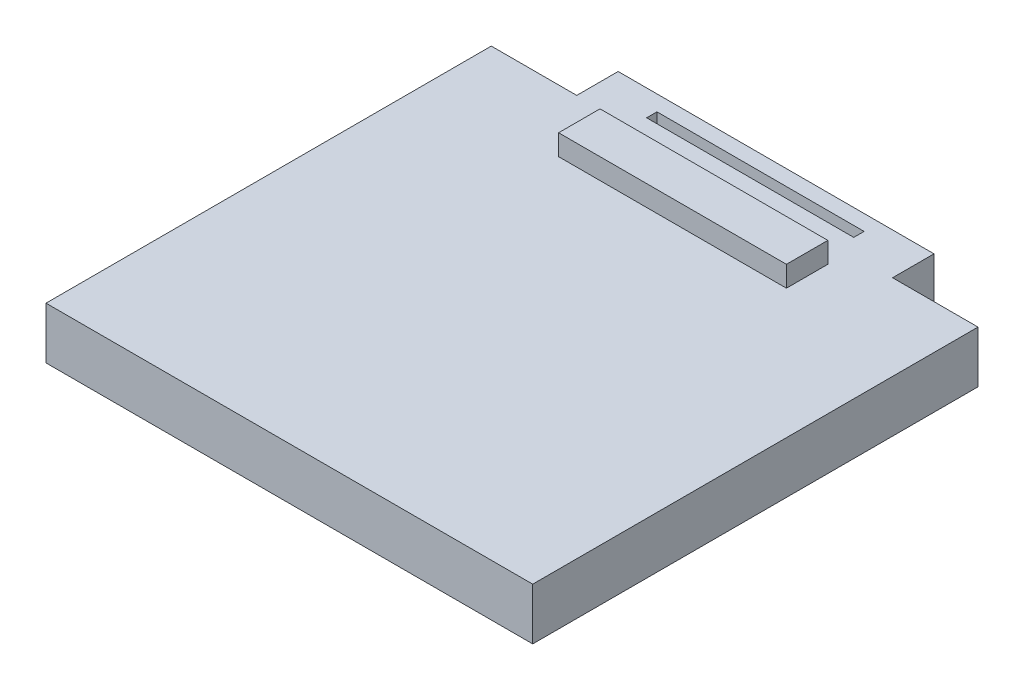
ISO-10303-21;
HEADER;
FILE_DESCRIPTION(('STEP AP214'),'2;1');
FILE_NAME('part.step','',(''),(''),'','','');
FILE_SCHEMA(('AUTOMOTIVE_DESIGN { 1 0 10303 214 1 1 1 1 }'));
ENDSEC;
DATA;
#1=APPLICATION_CONTEXT('core data for automotive mechanical design processes');
#2=APPLICATION_PROTOCOL_DEFINITION('international standard','automotive_design',2000,#1);
#3=PRODUCT_CONTEXT('',#1,'mechanical');
#4=PRODUCT('Part','Part','',(#3));
#5=PRODUCT_RELATED_PRODUCT_CATEGORY('part','',(#4));
#6=PRODUCT_DEFINITION_FORMATION('','',#4);
#7=PRODUCT_DEFINITION_CONTEXT('part definition',#1,'design');
#8=PRODUCT_DEFINITION('design','',#6,#7);
#9=PRODUCT_DEFINITION_SHAPE('','',#8);
#10=(LENGTH_UNIT() NAMED_UNIT(*) SI_UNIT(.MILLI.,.METRE.));
#11=(NAMED_UNIT(*) PLANE_ANGLE_UNIT() SI_UNIT($,.RADIAN.));
#12=(NAMED_UNIT(*) SI_UNIT($,.STERADIAN.) SOLID_ANGLE_UNIT());
#13=UNCERTAINTY_MEASURE_WITH_UNIT(LENGTH_MEASURE(1.E-05),#10,'distance_accuracy_value','');
#14=(GEOMETRIC_REPRESENTATION_CONTEXT(3) GLOBAL_UNCERTAINTY_ASSIGNED_CONTEXT((#13)) GLOBAL_UNIT_ASSIGNED_CONTEXT((#10,
#11,#12)) REPRESENTATION_CONTEXT('',''));
#15=CARTESIAN_POINT('',(0.,0.,0.));
#16=DIRECTION('',(0.,0.,1.));
#17=DIRECTION('',(1.,0.,0.));
#18=AXIS2_PLACEMENT_3D('',#15,#16,#17);
#19=CARTESIAN_POINT('',(0.,2.5,0.));
#20=DIRECTION('',(0.,1.,0.));
#21=DIRECTION('',(0.,0.,1.));
#22=AXIS2_PLACEMENT_3D('',#19,#20,#21);
#23=PLANE('',#22);
#24=DIRECTION('',(0.,0.,-1.));
#25=VECTOR('',#24,1.);
#26=CARTESIAN_POINT('',(5.00000000000001,2.5,-12.));
#27=LINE('',#26,#25);
#28=CARTESIAN_POINT('',(5.00000000000001,2.5,-11.5));
#29=VERTEX_POINT('',#28);
#30=CARTESIAN_POINT('',(5.00000000000001,2.5,-12.));
#31=VERTEX_POINT('',#30);
#32=EDGE_CURVE('E56',#29,#31,#27,.T.);
#33=ORIENTED_EDGE('',*,*,#32,.F.);
#34=DIRECTION('',(1.,0.,0.));
#35=VECTOR('',#34,1.);
#36=CARTESIAN_POINT('',(-4.99999999999999,2.5,-11.5));
#37=LINE('',#36,#35);
#38=CARTESIAN_POINT('',(-4.99999999999999,2.5,-11.5));
#39=VERTEX_POINT('',#38);
#40=EDGE_CURVE('E175',#39,#29,#37,.T.);
#41=ORIENTED_EDGE('',*,*,#40,.F.);
#42=DIRECTION('',(0.,0.,1.));
#43=VECTOR('',#42,1.);
#44=CARTESIAN_POINT('',(-4.99999999999999,2.5,-12.));
#45=LINE('',#44,#43);
#46=CARTESIAN_POINT('',(-4.99999999999999,2.5,-12.));
#47=VERTEX_POINT('',#46);
#48=EDGE_CURVE('E178',#47,#39,#45,.T.);
#49=ORIENTED_EDGE('',*,*,#48,.F.);
#50=DIRECTION('',(-1.,0.,0.));
#51=VECTOR('',#50,1.);
#52=CARTESIAN_POINT('',(-4.99999999999999,2.5,-12.));
#53=LINE('',#52,#51);
#54=EDGE_CURVE('E184',#31,#47,#53,.T.);
#55=ORIENTED_EDGE('',*,*,#54,.F.);
#56=EDGE_LOOP('',(#33,#41,#49,#55));
#57=FACE_BOUND('',#56,.T.);
#58=DIRECTION('',(0.,0.,-1.));
#59=VECTOR('',#58,1.);
#60=CARTESIAN_POINT('',(11.75,2.5,-10.75));
#61=LINE('',#60,#59);
#62=CARTESIAN_POINT('',(11.75,2.5,10.75));
#63=VERTEX_POINT('',#62);
#64=CARTESIAN_POINT('',(11.75,2.5,-10.75));
#65=VERTEX_POINT('',#64);
#66=EDGE_CURVE('E248',#63,#65,#61,.T.);
#67=ORIENTED_EDGE('',*,*,#66,.T.);
#68=DIRECTION('',(-1.,0.,0.));
#69=VECTOR('',#68,1.);
#70=CARTESIAN_POINT('',(-11.75,2.5,-10.75));
#71=LINE('',#70,#69);
#72=CARTESIAN_POINT('',(7.625,2.5,-10.75));
#73=VERTEX_POINT('',#72);
#74=EDGE_CURVE('E253',#65,#73,#71,.T.);
#75=ORIENTED_EDGE('',*,*,#74,.T.);
#76=DIRECTION('',(0.,0.,1.));
#77=VECTOR('',#76,1.);
#78=CARTESIAN_POINT('',(7.625,2.5,-12.75));
#79=LINE('',#78,#77);
#80=CARTESIAN_POINT('',(7.625,2.5,-12.75));
#81=VERTEX_POINT('',#80);
#82=EDGE_CURVE('E244',#81,#73,#79,.T.);
#83=ORIENTED_EDGE('',*,*,#82,.F.);
#84=DIRECTION('',(1.,0.,0.));
#85=VECTOR('',#84,1.);
#86=CARTESIAN_POINT('',(-7.625,2.5,-12.75));
#87=LINE('',#86,#85);
#88=CARTESIAN_POINT('',(-7.625,2.5,-12.75));
#89=VERTEX_POINT('',#88);
#90=EDGE_CURVE('E221',#89,#81,#87,.T.);
#91=ORIENTED_EDGE('',*,*,#90,.F.);
#92=DIRECTION('',(0.,0.,1.));
#93=VECTOR('',#92,1.);
#94=CARTESIAN_POINT('',(-7.625,2.5,-12.75));
#95=LINE('',#94,#93);
#96=CARTESIAN_POINT('',(-7.625,2.5,-10.75));
#97=VERTEX_POINT('',#96);
#98=EDGE_CURVE('E231',#89,#97,#95,.T.);
#99=ORIENTED_EDGE('',*,*,#98,.T.);
#100=CARTESIAN_POINT('',(-11.75,2.5,-10.75));
#101=VERTEX_POINT('',#100);
#102=EDGE_CURVE('E251',#97,#101,#71,.T.);
#103=ORIENTED_EDGE('',*,*,#102,.T.);
#104=DIRECTION('',(0.,0.,1.));
#105=VECTOR('',#104,1.);
#106=CARTESIAN_POINT('',(-11.75,2.5,-10.75));
#107=LINE('',#106,#105);
#108=CARTESIAN_POINT('',(-11.75,2.5,10.75));
#109=VERTEX_POINT('',#108);
#110=EDGE_CURVE('E256',#101,#109,#107,.T.);
#111=ORIENTED_EDGE('',*,*,#110,.T.);
#112=DIRECTION('',(1.,0.,0.));
#113=VECTOR('',#112,1.);
#114=CARTESIAN_POINT('',(-11.75,2.5,10.75));
#115=LINE('',#114,#113);
#116=EDGE_CURVE('E258',#109,#63,#115,.T.);
#117=ORIENTED_EDGE('',*,*,#116,.T.);
#118=EDGE_LOOP('',(#67,#75,#83,#91,#99,#103,#111,#117));
#119=FACE_BOUND('',#118,.T.);
#120=DIRECTION('',(-1.,0.,0.));
#121=VECTOR('',#120,1.);
#122=CARTESIAN_POINT('',(-5.50000000000001,2.5,-9.75));
#123=LINE('',#122,#121);
#124=CARTESIAN_POINT('',(5.49999999999999,2.5,-9.75));
#125=VERTEX_POINT('',#124);
#126=CARTESIAN_POINT('',(-5.50000000000001,2.5,-9.75));
#127=VERTEX_POINT('',#126);
#128=EDGE_CURVE('E207',#125,#127,#123,.T.);
#129=ORIENTED_EDGE('',*,*,#128,.F.);
#130=DIRECTION('',(0.,0.,-1.));
#131=VECTOR('',#130,1.);
#132=CARTESIAN_POINT('',(5.49999999999999,2.5,-9.75));
#133=LINE('',#132,#131);
#134=CARTESIAN_POINT('',(5.49999999999999,2.5,-7.75));
#135=VERTEX_POINT('',#134);
#136=EDGE_CURVE('E190',#135,#125,#133,.T.);
#137=ORIENTED_EDGE('',*,*,#136,.F.);
#138=DIRECTION('',(1.,0.,0.));
#139=VECTOR('',#138,1.);
#140=CARTESIAN_POINT('',(-5.50000000000001,2.5,-7.75));
#141=LINE('',#140,#139);
#142=CARTESIAN_POINT('',(-5.50000000000001,2.5,-7.75));
#143=VERTEX_POINT('',#142);
#144=EDGE_CURVE('E198',#143,#135,#141,.T.);
#145=ORIENTED_EDGE('',*,*,#144,.F.);
#146=DIRECTION('',(0.,0.,1.));
#147=VECTOR('',#146,1.);
#148=CARTESIAN_POINT('',(-5.50000000000001,2.5,-9.75));
#149=LINE('',#148,#147);
#150=EDGE_CURVE('E209',#127,#143,#149,.T.);
#151=ORIENTED_EDGE('',*,*,#150,.F.);
#152=EDGE_LOOP('',(#129,#137,#145,#151));
#153=FACE_BOUND('',#152,.T.);
#154=ADVANCED_FACE('F41',(#57,#119,#153),#23,.T.);
#155=CARTESIAN_POINT('',(-11.75,2.5,-10.75));
#156=DIRECTION('',(0.,0.,1.));
#157=DIRECTION('',(1.,0.,0.));
#158=AXIS2_PLACEMENT_3D('',#155,#156,#157);
#159=PLANE('',#158);
#160=DIRECTION('',(0.,1.,0.));
#161=VECTOR('',#160,1.);
#162=CARTESIAN_POINT('',(-7.625,0.,-10.75));
#163=LINE('',#162,#161);
#164=CARTESIAN_POINT('',(-7.625,0.,-10.75));
#165=VERTEX_POINT('',#164);
#166=EDGE_CURVE('E225',#165,#97,#163,.T.);
#167=ORIENTED_EDGE('',*,*,#166,.F.);
#168=DIRECTION('',(-1.,0.,0.));
#169=VECTOR('',#168,1.);
#170=CARTESIAN_POINT('',(-11.75,0.,-10.75));
#171=LINE('',#170,#169);
#172=CARTESIAN_POINT('',(-11.75,0.,-10.75));
#173=VERTEX_POINT('',#172);
#174=EDGE_CURVE('E263',#165,#173,#171,.T.);
#175=ORIENTED_EDGE('',*,*,#174,.T.);
#176=DIRECTION('',(0.,-1.,0.));
#177=VECTOR('',#176,1.);
#178=CARTESIAN_POINT('',(-11.75,2.5,-10.75));
#179=LINE('',#178,#177);
#180=EDGE_CURVE('E49',#101,#173,#179,.T.);
#181=ORIENTED_EDGE('',*,*,#180,.F.);
#182=ORIENTED_EDGE('',*,*,#102,.F.);
#183=EDGE_LOOP('',(#167,#175,#181,#182));
#184=FACE_BOUND('',#183,.T.);
#185=ADVANCED_FACE('F299',(#184),#159,.F.);
#186=DIRECTION('',(0.,-1.,0.));
#187=VECTOR('',#186,1.);
#188=CARTESIAN_POINT('',(7.625,2.5,-10.75));
#189=LINE('',#188,#187);
#190=CARTESIAN_POINT('',(7.625,0.,-10.75));
#191=VERTEX_POINT('',#190);
#192=EDGE_CURVE('E220',#73,#191,#189,.T.);
#193=ORIENTED_EDGE('',*,*,#192,.F.);
#194=ORIENTED_EDGE('',*,*,#74,.F.);
#195=DIRECTION('',(0.,-1.,0.));
#196=VECTOR('',#195,1.);
#197=CARTESIAN_POINT('',(11.75,2.5,-10.75));
#198=LINE('',#197,#196);
#199=CARTESIAN_POINT('',(11.75,0.,-10.75));
#200=VERTEX_POINT('',#199);
#201=EDGE_CURVE('E11',#65,#200,#198,.T.);
#202=ORIENTED_EDGE('',*,*,#201,.T.);
#203=EDGE_CURVE('E264',#200,#191,#171,.T.);
#204=ORIENTED_EDGE('',*,*,#203,.T.);
#205=EDGE_LOOP('',(#193,#194,#202,#204));
#206=FACE_BOUND('',#205,.T.);
#207=ADVANCED_FACE('F310',(#206),#159,.F.);
#208=CARTESIAN_POINT('',(11.75,2.5,-10.75));
#209=DIRECTION('',(-1.,0.,0.));
#210=DIRECTION('',(0.,0.,1.));
#211=AXIS2_PLACEMENT_3D('',#208,#209,#210);
#212=PLANE('',#211);
#213=DIRECTION('',(0.,0.,-1.));
#214=VECTOR('',#213,1.);
#215=CARTESIAN_POINT('',(11.75,0.,-10.75));
#216=LINE('',#215,#214);
#217=CARTESIAN_POINT('',(11.75,0.,10.75));
#218=VERTEX_POINT('',#217);
#219=EDGE_CURVE('E247',#218,#200,#216,.T.);
#220=ORIENTED_EDGE('',*,*,#219,.T.);
#221=ORIENTED_EDGE('',*,*,#201,.F.);
#222=ORIENTED_EDGE('',*,*,#66,.F.);
#223=DIRECTION('',(0.,-1.,0.));
#224=VECTOR('',#223,1.);
#225=CARTESIAN_POINT('',(11.75,2.5,10.75));
#226=LINE('',#225,#224);
#227=EDGE_CURVE('E260',#63,#218,#226,.T.);
#228=ORIENTED_EDGE('',*,*,#227,.T.);
#229=EDGE_LOOP('',(#220,#221,#222,#228));
#230=FACE_BOUND('',#229,.T.);
#231=ADVANCED_FACE('F43',(#230),#212,.F.);
#232=CARTESIAN_POINT('',(-11.75,2.5,-10.75));
#233=DIRECTION('',(1.,0.,0.));
#234=DIRECTION('',(0.,0.,-1.));
#235=AXIS2_PLACEMENT_3D('',#232,#233,#234);
#236=PLANE('',#235);
#237=DIRECTION('',(0.,0.,1.));
#238=VECTOR('',#237,1.);
#239=CARTESIAN_POINT('',(-11.75,0.,-10.75));
#240=LINE('',#239,#238);
#241=CARTESIAN_POINT('',(-11.75,0.,10.75));
#242=VERTEX_POINT('',#241);
#243=EDGE_CURVE('E266',#173,#242,#240,.T.);
#244=ORIENTED_EDGE('',*,*,#243,.T.);
#245=DIRECTION('',(0.,-1.,0.));
#246=VECTOR('',#245,1.);
#247=CARTESIAN_POINT('',(-11.75,2.5,10.75));
#248=LINE('',#247,#246);
#249=EDGE_CURVE('E271',#109,#242,#248,.T.);
#250=ORIENTED_EDGE('',*,*,#249,.F.);
#251=ORIENTED_EDGE('',*,*,#110,.F.);
#252=ORIENTED_EDGE('',*,*,#180,.T.);
#253=EDGE_LOOP('',(#244,#250,#251,#252));
#254=FACE_BOUND('',#253,.T.);
#255=ADVANCED_FACE('F278',(#254),#236,.F.);
#256=CARTESIAN_POINT('',(-11.75,2.5,10.75));
#257=DIRECTION('',(0.,0.,-1.));
#258=DIRECTION('',(-1.,0.,0.));
#259=AXIS2_PLACEMENT_3D('',#256,#257,#258);
#260=PLANE('',#259);
#261=DIRECTION('',(1.,0.,0.));
#262=VECTOR('',#261,1.);
#263=CARTESIAN_POINT('',(-11.75,0.,10.75));
#264=LINE('',#263,#262);
#265=EDGE_CURVE('E252',#242,#218,#264,.T.);
#266=ORIENTED_EDGE('',*,*,#265,.T.);
#267=ORIENTED_EDGE('',*,*,#227,.F.);
#268=ORIENTED_EDGE('',*,*,#116,.F.);
#269=ORIENTED_EDGE('',*,*,#249,.T.);
#270=EDGE_LOOP('',(#266,#267,#268,#269));
#271=FACE_BOUND('',#270,.T.);
#272=ADVANCED_FACE('F289',(#271),#260,.F.);
#273=CARTESIAN_POINT('',(0.,0.,0.));
#274=DIRECTION('',(0.,1.,0.));
#275=DIRECTION('',(0.,0.,1.));
#276=AXIS2_PLACEMENT_3D('',#273,#274,#275);
#277=PLANE('',#276);
#278=ORIENTED_EDGE('',*,*,#219,.F.);
#279=ORIENTED_EDGE('',*,*,#265,.F.);
#280=ORIENTED_EDGE('',*,*,#243,.F.);
#281=ORIENTED_EDGE('',*,*,#174,.F.);
#282=DIRECTION('',(0.,0.,1.));
#283=VECTOR('',#282,1.);
#284=CARTESIAN_POINT('',(-7.625,0.,-12.75));
#285=LINE('',#284,#283);
#286=CARTESIAN_POINT('',(-7.625,0.,-12.75));
#287=VERTEX_POINT('',#286);
#288=EDGE_CURVE('E238',#287,#165,#285,.T.);
#289=ORIENTED_EDGE('',*,*,#288,.F.);
#290=DIRECTION('',(-1.,0.,0.));
#291=VECTOR('',#290,1.);
#292=CARTESIAN_POINT('',(7.625,0.,-12.75));
#293=LINE('',#292,#291);
#294=CARTESIAN_POINT('',(7.625,0.,-12.75));
#295=VERTEX_POINT('',#294);
#296=EDGE_CURVE('E227',#295,#287,#293,.T.);
#297=ORIENTED_EDGE('',*,*,#296,.F.);
#298=DIRECTION('',(0.,0.,1.));
#299=VECTOR('',#298,1.);
#300=CARTESIAN_POINT('',(7.625,0.,-12.75));
#301=LINE('',#300,#299);
#302=EDGE_CURVE('E241',#295,#191,#301,.T.);
#303=ORIENTED_EDGE('',*,*,#302,.T.);
#304=ORIENTED_EDGE('',*,*,#203,.F.);
#305=EDGE_LOOP('',(#278,#279,#280,#281,#289,#297,#303,#304));
#306=FACE_BOUND('',#305,.T.);
#307=ADVANCED_FACE('F285',(#306),#277,.F.);
#308=CARTESIAN_POINT('',(7.625,2.5,-12.75));
#309=DIRECTION('',(-1.,0.,0.));
#310=DIRECTION('',(0.,0.,1.));
#311=AXIS2_PLACEMENT_3D('',#308,#309,#310);
#312=PLANE('',#311);
#313=ORIENTED_EDGE('',*,*,#192,.T.);
#314=ORIENTED_EDGE('',*,*,#302,.F.);
#315=DIRECTION('',(0.,-1.,0.));
#316=VECTOR('',#315,1.);
#317=CARTESIAN_POINT('',(7.625,2.5,-12.75));
#318=LINE('',#317,#316);
#319=EDGE_CURVE('E224',#81,#295,#318,.T.);
#320=ORIENTED_EDGE('',*,*,#319,.F.);
#321=ORIENTED_EDGE('',*,*,#82,.T.);
#322=EDGE_LOOP('',(#313,#314,#320,#321));
#323=FACE_BOUND('',#322,.T.);
#324=ADVANCED_FACE('F308',(#323),#312,.F.);
#325=CARTESIAN_POINT('',(-7.625,0.,-12.75));
#326=DIRECTION('',(1.,0.,0.));
#327=DIRECTION('',(0.,0.,-1.));
#328=AXIS2_PLACEMENT_3D('',#325,#326,#327);
#329=PLANE('',#328);
#330=ORIENTED_EDGE('',*,*,#166,.T.);
#331=ORIENTED_EDGE('',*,*,#98,.F.);
#332=DIRECTION('',(0.,1.,0.));
#333=VECTOR('',#332,1.);
#334=CARTESIAN_POINT('',(-7.625,0.,-12.75));
#335=LINE('',#334,#333);
#336=EDGE_CURVE('E229',#287,#89,#335,.T.);
#337=ORIENTED_EDGE('',*,*,#336,.F.);
#338=ORIENTED_EDGE('',*,*,#288,.T.);
#339=EDGE_LOOP('',(#330,#331,#337,#338));
#340=FACE_BOUND('',#339,.T.);
#341=ADVANCED_FACE('F301',(#340),#329,.F.);
#342=CARTESIAN_POINT('',(0.,0.,-12.75));
#343=DIRECTION('',(0.,0.,-1.));
#344=DIRECTION('',(-1.,0.,0.));
#345=AXIS2_PLACEMENT_3D('',#342,#343,#344);
#346=PLANE('',#345);
#347=ORIENTED_EDGE('',*,*,#90,.T.);
#348=ORIENTED_EDGE('',*,*,#319,.T.);
#349=ORIENTED_EDGE('',*,*,#296,.T.);
#350=ORIENTED_EDGE('',*,*,#336,.T.);
#351=EDGE_LOOP('',(#347,#348,#349,#350));
#352=FACE_BOUND('',#351,.T.);
#353=ADVANCED_FACE('F306',(#352),#346,.T.);
#354=CARTESIAN_POINT('',(5.49999999999999,3.5,-9.75));
#355=DIRECTION('',(-1.,0.,0.));
#356=DIRECTION('',(0.,0.,1.));
#357=AXIS2_PLACEMENT_3D('',#354,#355,#356);
#358=PLANE('',#357);
#359=ORIENTED_EDGE('',*,*,#136,.T.);
#360=DIRECTION('',(0.,-1.,0.));
#361=VECTOR('',#360,1.);
#362=CARTESIAN_POINT('',(5.49999999999999,3.5,-9.75));
#363=LINE('',#362,#361);
#364=CARTESIAN_POINT('',(5.49999999999999,3.5,-9.75));
#365=VERTEX_POINT('',#364);
#366=EDGE_CURVE('E218',#365,#125,#363,.T.);
#367=ORIENTED_EDGE('',*,*,#366,.F.);
#368=DIRECTION('',(0.,0.,-1.));
#369=VECTOR('',#368,1.);
#370=CARTESIAN_POINT('',(5.49999999999999,3.5,-9.75));
#371=LINE('',#370,#369);
#372=CARTESIAN_POINT('',(5.49999999999999,3.5,-7.75));
#373=VERTEX_POINT('',#372);
#374=EDGE_CURVE('E194',#373,#365,#371,.T.);
#375=ORIENTED_EDGE('',*,*,#374,.F.);
#376=DIRECTION('',(0.,-1.,0.));
#377=VECTOR('',#376,1.);
#378=CARTESIAN_POINT('',(5.49999999999999,3.5,-7.75));
#379=LINE('',#378,#377);
#380=EDGE_CURVE('E204',#373,#135,#379,.T.);
#381=ORIENTED_EDGE('',*,*,#380,.T.);
#382=EDGE_LOOP('',(#359,#367,#375,#381));
#383=FACE_BOUND('',#382,.T.);
#384=ADVANCED_FACE('F370',(#383),#358,.F.);
#385=CARTESIAN_POINT('',(-5.50000000000001,3.5,-9.75));
#386=DIRECTION('',(0.,0.,1.));
#387=DIRECTION('',(1.,0.,0.));
#388=AXIS2_PLACEMENT_3D('',#385,#386,#387);
#389=PLANE('',#388);
#390=ORIENTED_EDGE('',*,*,#128,.T.);
#391=DIRECTION('',(0.,-1.,0.));
#392=VECTOR('',#391,1.);
#393=CARTESIAN_POINT('',(-5.50000000000001,3.5,-9.75));
#394=LINE('',#393,#392);
#395=CARTESIAN_POINT('',(-5.50000000000001,3.5,-9.75));
#396=VERTEX_POINT('',#395);
#397=EDGE_CURVE('E215',#396,#127,#394,.T.);
#398=ORIENTED_EDGE('',*,*,#397,.F.);
#399=DIRECTION('',(-1.,0.,0.));
#400=VECTOR('',#399,1.);
#401=CARTESIAN_POINT('',(-5.50000000000001,3.5,-9.75));
#402=LINE('',#401,#400);
#403=EDGE_CURVE('E197',#365,#396,#402,.T.);
#404=ORIENTED_EDGE('',*,*,#403,.F.);
#405=ORIENTED_EDGE('',*,*,#366,.T.);
#406=EDGE_LOOP('',(#390,#398,#404,#405));
#407=FACE_BOUND('',#406,.T.);
#408=ADVANCED_FACE('F384',(#407),#389,.F.);
#409=CARTESIAN_POINT('',(-5.50000000000001,3.5,-9.75));
#410=DIRECTION('',(1.,0.,0.));
#411=DIRECTION('',(0.,0.,-1.));
#412=AXIS2_PLACEMENT_3D('',#409,#410,#411);
#413=PLANE('',#412);
#414=ORIENTED_EDGE('',*,*,#150,.T.);
#415=DIRECTION('',(0.,-1.,0.));
#416=VECTOR('',#415,1.);
#417=CARTESIAN_POINT('',(-5.50000000000001,3.5,-7.75));
#418=LINE('',#417,#416);
#419=CARTESIAN_POINT('',(-5.50000000000001,3.5,-7.75));
#420=VERTEX_POINT('',#419);
#421=EDGE_CURVE('E64',#420,#143,#418,.T.);
#422=ORIENTED_EDGE('',*,*,#421,.F.);
#423=DIRECTION('',(0.,0.,1.));
#424=VECTOR('',#423,1.);
#425=CARTESIAN_POINT('',(-5.50000000000001,3.5,-9.75));
#426=LINE('',#425,#424);
#427=EDGE_CURVE('E200',#396,#420,#426,.T.);
#428=ORIENTED_EDGE('',*,*,#427,.F.);
#429=ORIENTED_EDGE('',*,*,#397,.T.);
#430=EDGE_LOOP('',(#414,#422,#428,#429));
#431=FACE_BOUND('',#430,.T.);
#432=ADVANCED_FACE('F393',(#431),#413,.F.);
#433=CARTESIAN_POINT('',(-5.50000000000001,3.5,-7.75));
#434=DIRECTION('',(0.,0.,-1.));
#435=DIRECTION('',(-1.,0.,0.));
#436=AXIS2_PLACEMENT_3D('',#433,#434,#435);
#437=PLANE('',#436);
#438=ORIENTED_EDGE('',*,*,#144,.T.);
#439=ORIENTED_EDGE('',*,*,#380,.F.);
#440=DIRECTION('',(1.,0.,0.));
#441=VECTOR('',#440,1.);
#442=CARTESIAN_POINT('',(-5.50000000000001,3.5,-7.75));
#443=LINE('',#442,#441);
#444=EDGE_CURVE('E202',#420,#373,#443,.T.);
#445=ORIENTED_EDGE('',*,*,#444,.F.);
#446=ORIENTED_EDGE('',*,*,#421,.T.);
#447=EDGE_LOOP('',(#438,#439,#445,#446));
#448=FACE_BOUND('',#447,.T.);
#449=ADVANCED_FACE('F402',(#448),#437,.F.);
#450=CARTESIAN_POINT('',(0.,3.5,0.));
#451=DIRECTION('',(0.,1.,0.));
#452=DIRECTION('',(0.,0.,1.));
#453=AXIS2_PLACEMENT_3D('',#450,#451,#452);
#454=PLANE('',#453);
#455=ORIENTED_EDGE('',*,*,#374,.T.);
#456=ORIENTED_EDGE('',*,*,#403,.T.);
#457=ORIENTED_EDGE('',*,*,#427,.T.);
#458=ORIENTED_EDGE('',*,*,#444,.T.);
#459=EDGE_LOOP('',(#455,#456,#457,#458));
#460=FACE_BOUND('',#459,.T.);
#461=ADVANCED_FACE('F411',(#460),#454,.T.);
#462=CARTESIAN_POINT('',(5.00000000000001,1.75,-12.));
#463=DIRECTION('',(1.,0.,0.));
#464=DIRECTION('',(0.,0.,-1.));
#465=AXIS2_PLACEMENT_3D('',#462,#463,#464);
#466=PLANE('',#465);
#467=ORIENTED_EDGE('',*,*,#32,.T.);
#468=DIRECTION('',(0.,1.,0.));
#469=VECTOR('',#468,1.);
#470=CARTESIAN_POINT('',(5.00000000000001,1.75,-12.));
#471=LINE('',#470,#469);
#472=CARTESIAN_POINT('',(5.00000000000001,1.75,-12.));
#473=VERTEX_POINT('',#472);
#474=EDGE_CURVE('E153',#473,#31,#471,.T.);
#475=ORIENTED_EDGE('',*,*,#474,.F.);
#476=DIRECTION('',(0.,0.,-1.));
#477=VECTOR('',#476,1.);
#478=CARTESIAN_POINT('',(5.00000000000001,1.75,-12.));
#479=LINE('',#478,#477);
#480=CARTESIAN_POINT('',(5.00000000000001,1.75,-11.5));
#481=VERTEX_POINT('',#480);
#482=EDGE_CURVE('E157',#481,#473,#479,.T.);
#483=ORIENTED_EDGE('',*,*,#482,.F.);
#484=DIRECTION('',(0.,1.,0.));
#485=VECTOR('',#484,1.);
#486=CARTESIAN_POINT('',(5.00000000000001,1.75,-11.5));
#487=LINE('',#486,#485);
#488=EDGE_CURVE('E188',#481,#29,#487,.T.);
#489=ORIENTED_EDGE('',*,*,#488,.T.);
#490=EDGE_LOOP('',(#467,#475,#483,#489));
#491=FACE_BOUND('',#490,.T.);
#492=ADVANCED_FACE('F155',(#491),#466,.F.);
#493=CARTESIAN_POINT('',(-4.99999999999999,1.75,-11.5));
#494=DIRECTION('',(0.,0.,1.));
#495=DIRECTION('',(1.,0.,0.));
#496=AXIS2_PLACEMENT_3D('',#493,#494,#495);
#497=PLANE('',#496);
#498=ORIENTED_EDGE('',*,*,#40,.T.);
#499=ORIENTED_EDGE('',*,*,#488,.F.);
#500=DIRECTION('',(1.,0.,0.));
#501=VECTOR('',#500,1.);
#502=CARTESIAN_POINT('',(-4.99999999999999,1.75,-11.5));
#503=LINE('',#502,#501);
#504=CARTESIAN_POINT('',(-4.99999999999999,1.75,-11.5));
#505=VERTEX_POINT('',#504);
#506=EDGE_CURVE('E163',#505,#481,#503,.T.);
#507=ORIENTED_EDGE('',*,*,#506,.F.);
#508=DIRECTION('',(0.,1.,0.));
#509=VECTOR('',#508,1.);
#510=CARTESIAN_POINT('',(-4.99999999999999,1.75,-11.5));
#511=LINE('',#510,#509);
#512=EDGE_CURVE('E191',#505,#39,#511,.T.);
#513=ORIENTED_EDGE('',*,*,#512,.T.);
#514=EDGE_LOOP('',(#498,#499,#507,#513));
#515=FACE_BOUND('',#514,.T.);
#516=ADVANCED_FACE('F425',(#515),#497,.F.);
#517=CARTESIAN_POINT('',(-4.99999999999999,1.75,-12.));
#518=DIRECTION('',(-1.,0.,0.));
#519=DIRECTION('',(0.,0.,1.));
#520=AXIS2_PLACEMENT_3D('',#517,#518,#519);
#521=PLANE('',#520);
#522=ORIENTED_EDGE('',*,*,#48,.T.);
#523=ORIENTED_EDGE('',*,*,#512,.F.);
#524=DIRECTION('',(0.,0.,1.));
#525=VECTOR('',#524,1.);
#526=CARTESIAN_POINT('',(-4.99999999999999,1.75,-12.));
#527=LINE('',#526,#525);
#528=CARTESIAN_POINT('',(-4.99999999999999,1.75,-12.));
#529=VERTEX_POINT('',#528);
#530=EDGE_CURVE('E171',#529,#505,#527,.T.);
#531=ORIENTED_EDGE('',*,*,#530,.F.);
#532=DIRECTION('',(0.,1.,0.));
#533=VECTOR('',#532,1.);
#534=CARTESIAN_POINT('',(-4.99999999999999,1.75,-12.));
#535=LINE('',#534,#533);
#536=EDGE_CURVE('E162',#529,#47,#535,.T.);
#537=ORIENTED_EDGE('',*,*,#536,.T.);
#538=EDGE_LOOP('',(#522,#523,#531,#537));
#539=FACE_BOUND('',#538,.T.);
#540=ADVANCED_FACE('F433',(#539),#521,.F.);
#541=CARTESIAN_POINT('',(-4.99999999999999,1.75,-12.));
#542=DIRECTION('',(0.,0.,-1.));
#543=DIRECTION('',(-1.,0.,0.));
#544=AXIS2_PLACEMENT_3D('',#541,#542,#543);
#545=PLANE('',#544);
#546=ORIENTED_EDGE('',*,*,#54,.T.);
#547=ORIENTED_EDGE('',*,*,#536,.F.);
#548=DIRECTION('',(-1.,0.,0.));
#549=VECTOR('',#548,1.);
#550=CARTESIAN_POINT('',(-4.99999999999999,1.75,-12.));
#551=LINE('',#550,#549);
#552=EDGE_CURVE('E166',#473,#529,#551,.T.);
#553=ORIENTED_EDGE('',*,*,#552,.F.);
#554=ORIENTED_EDGE('',*,*,#474,.T.);
#555=EDGE_LOOP('',(#546,#547,#553,#554));
#556=FACE_BOUND('',#555,.T.);
#557=ADVANCED_FACE('F167',(#556),#545,.F.);
#558=CARTESIAN_POINT('',(0.,1.75,0.));
#559=DIRECTION('',(0.,1.,0.));
#560=DIRECTION('',(0.,0.,1.));
#561=AXIS2_PLACEMENT_3D('',#558,#559,#560);
#562=PLANE('',#561);
#563=ORIENTED_EDGE('',*,*,#482,.T.);
#564=ORIENTED_EDGE('',*,*,#552,.T.);
#565=ORIENTED_EDGE('',*,*,#530,.T.);
#566=ORIENTED_EDGE('',*,*,#506,.T.);
#567=EDGE_LOOP('',(#563,#564,#565,#566));
#568=FACE_BOUND('',#567,.T.);
#569=ADVANCED_FACE('F173',(#568),#562,.T.);
#570=CLOSED_SHELL('',(#154,#185,#207,#231,#255,#272,#307,#324,#341,#353,#384,#408,#432,#449,
#461,#492,#516,#540,#557,#569));
#571=MANIFOLD_SOLID_BREP('B2',#570);
#572=ADVANCED_BREP_SHAPE_REPRESENTATION('',(#18,#571),#14);
#573=SHAPE_DEFINITION_REPRESENTATION(#9,#572);
ENDSEC;
END-ISO-10303-21;
